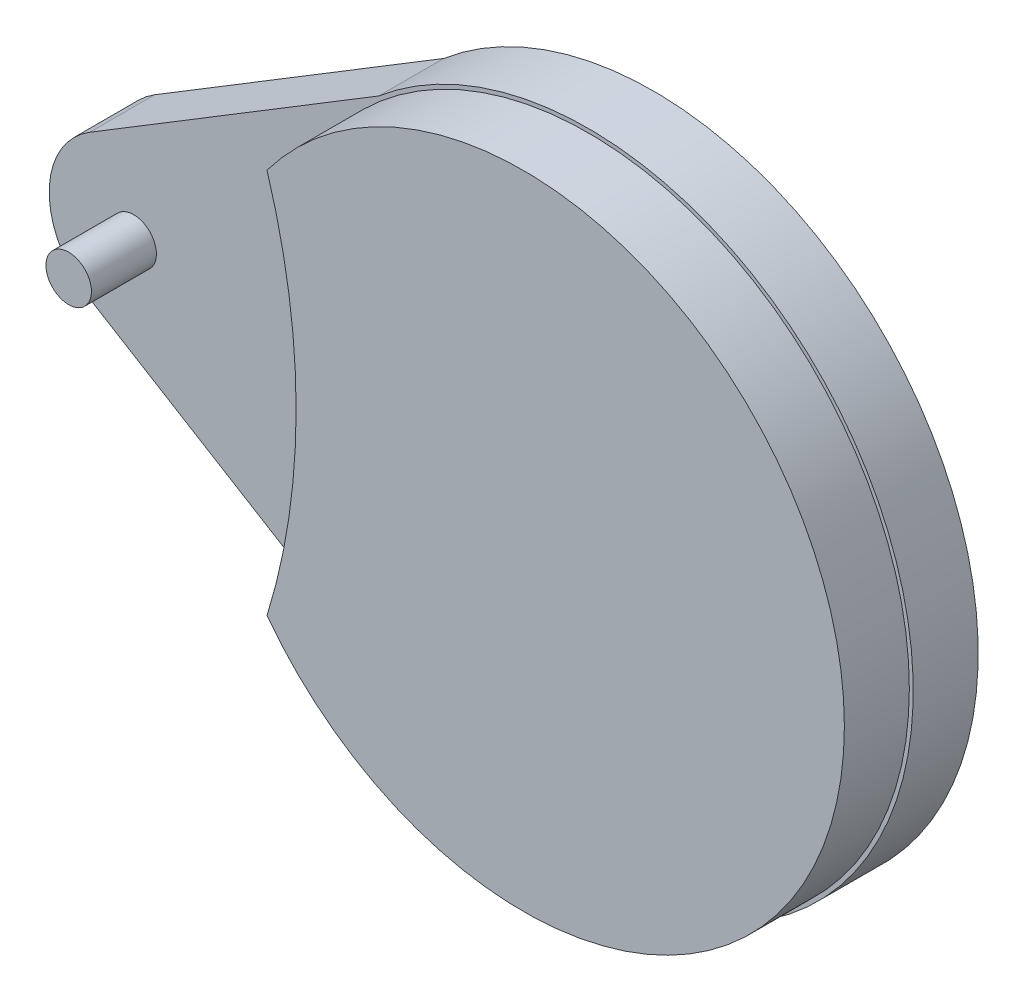
ISO-10303-21;
HEADER;
FILE_DESCRIPTION(('STEP AP214'),'2;1');
FILE_NAME('part.step','',(''),(''),'','','');
FILE_SCHEMA(('AUTOMOTIVE_DESIGN { 1 0 10303 214 1 1 1 1 }'));
ENDSEC;
DATA;
#1=APPLICATION_CONTEXT('core data for automotive mechanical design processes');
#2=APPLICATION_PROTOCOL_DEFINITION('international standard','automotive_design',2000,#1);
#3=PRODUCT_CONTEXT('',#1,'mechanical');
#4=PRODUCT('Part','Part','',(#3));
#5=PRODUCT_RELATED_PRODUCT_CATEGORY('part','',(#4));
#6=PRODUCT_DEFINITION_FORMATION('','',#4);
#7=PRODUCT_DEFINITION_CONTEXT('part definition',#1,'design');
#8=PRODUCT_DEFINITION('design','',#6,#7);
#9=PRODUCT_DEFINITION_SHAPE('','',#8);
#10=(LENGTH_UNIT() NAMED_UNIT(*) SI_UNIT(.MILLI.,.METRE.));
#11=(NAMED_UNIT(*) PLANE_ANGLE_UNIT() SI_UNIT($,.RADIAN.));
#12=(NAMED_UNIT(*) SI_UNIT($,.STERADIAN.) SOLID_ANGLE_UNIT());
#13=UNCERTAINTY_MEASURE_WITH_UNIT(LENGTH_MEASURE(1.E-05),#10,'distance_accuracy_value','');
#14=(GEOMETRIC_REPRESENTATION_CONTEXT(3) GLOBAL_UNCERTAINTY_ASSIGNED_CONTEXT((#13)) GLOBAL_UNIT_ASSIGNED_CONTEXT((#10,
#11,#12)) REPRESENTATION_CONTEXT('',''));
#15=CARTESIAN_POINT('',(0.,0.,0.));
#16=DIRECTION('',(0.,0.,1.));
#17=DIRECTION('',(1.,0.,0.));
#18=AXIS2_PLACEMENT_3D('',#15,#16,#17);
#19=CARTESIAN_POINT('',(5.48808372365144,-9.01487682632704,-5.));
#20=DIRECTION('',(0.52,-0.854166260162505,0.));
#21=DIRECTION('',(0.854166260162505,0.52,0.));
#22=AXIS2_PLACEMENT_3D('',#19,#20,#21);
#23=PLANE('',#22);
#24=DIRECTION('',(0.854166260162505,0.52,0.));
#25=VECTOR('',#24,1.);
#26=CARTESIAN_POINT('',(5.48808372365144,-9.01487682632704,0.));
#27=LINE('',#26,#25);
#28=CARTESIAN_POINT('',(29.4161676170541,5.55208069105628,0.));
#29=VERTEX_POINT('',#28);
#30=CARTESIAN_POINT('',(51.6539353632551,19.0900062300778,0.));
#31=VERTEX_POINT('',#30);
#32=EDGE_CURVE('E118',#29,#31,#27,.T.);
#33=ORIENTED_EDGE('',*,*,#32,.T.);
#34=DIRECTION('',(0.,0.,1.));
#35=VECTOR('',#34,1.);
#36=CARTESIAN_POINT('',(51.6539353632551,19.0900062300778,-5.));
#37=LINE('',#36,#35);
#38=CARTESIAN_POINT('',(51.6539353632551,19.0900062300778,-5.));
#39=VERTEX_POINT('',#38);
#40=EDGE_CURVE('E11',#39,#31,#37,.T.);
#41=ORIENTED_EDGE('',*,*,#40,.F.);
#42=DIRECTION('',(0.854166260162505,0.52,0.));
#43=VECTOR('',#42,1.);
#44=CARTESIAN_POINT('',(5.48808372365144,-9.01487682632704,-5.));
#45=LINE('',#44,#43);
#46=CARTESIAN_POINT('',(29.4161676170541,5.55208069105628,-5.));
#47=VERTEX_POINT('',#46);
#48=EDGE_CURVE('E73',#47,#39,#45,.T.);
#49=ORIENTED_EDGE('',*,*,#48,.F.);
#50=DIRECTION('',(0.,0.,1.));
#51=VECTOR('',#50,1.);
#52=CARTESIAN_POINT('',(29.4161676170541,5.55208069105628,-5.));
#53=LINE('',#52,#51);
#54=EDGE_CURVE('E50',#47,#29,#53,.T.);
#55=ORIENTED_EDGE('',*,*,#54,.T.);
#56=EDGE_LOOP('',(#33,#41,#49,#55));
#57=FACE_BOUND('',#56,.T.);
#58=ADVANCED_FACE('F47',(#57),#23,.F.);
#59=CARTESIAN_POINT('',(67.7961676170542,0.,-5.));
#60=DIRECTION('',(0.,0.,1.));
#61=DIRECTION('',(1.,0.,0.));
#62=AXIS2_PLACEMENT_3D('',#59,#60,#61);
#63=CYLINDRICAL_SURFACE('',#62,25.);
#64=CARTESIAN_POINT('',(67.7961676170542,0.,0.));
#65=DIRECTION('',(0.,0.,1.));
#66=DIRECTION('',(1.,0.,0.));
#67=AXIS2_PLACEMENT_3D('',#64,#65,#66);
#68=CIRCLE('',#67,25.);
#69=CARTESIAN_POINT('',(51.6539353632551,-19.0900062300778,0.));
#70=VERTEX_POINT('',#69);
#71=EDGE_CURVE('E142',#70,#31,#68,.T.);
#72=ORIENTED_EDGE('',*,*,#71,.F.);
#73=DIRECTION('',(0.,0.,1.));
#74=VECTOR('',#73,1.);
#75=CARTESIAN_POINT('',(51.6539353632551,-19.0900062300778,-5.));
#76=LINE('',#75,#74);
#77=CARTESIAN_POINT('',(51.6539353632551,-19.0900062300778,-5.));
#78=VERTEX_POINT('',#77);
#79=EDGE_CURVE('E56',#78,#70,#76,.T.);
#80=ORIENTED_EDGE('',*,*,#79,.F.);
#81=CARTESIAN_POINT('',(67.7961676170542,0.,-5.));
#82=DIRECTION('',(0.,0.,1.));
#83=DIRECTION('',(1.,0.,0.));
#84=AXIS2_PLACEMENT_3D('',#81,#82,#83);
#85=CIRCLE('',#84,25.);
#86=EDGE_CURVE('E149',#78,#39,#85,.T.);
#87=ORIENTED_EDGE('',*,*,#86,.T.);
#88=ORIENTED_EDGE('',*,*,#40,.T.);
#89=EDGE_LOOP('',(#72,#80,#87,#88));
#90=FACE_BOUND('',#89,.T.);
#91=ADVANCED_FACE('F183',(#90),#63,.T.);
#92=CARTESIAN_POINT('',(5.48808372365144,9.01487682632704,-5.));
#93=DIRECTION('',(-0.52,-0.854166260162505,0.));
#94=DIRECTION('',(0.854166260162505,-0.52,0.));
#95=AXIS2_PLACEMENT_3D('',#92,#93,#94);
#96=PLANE('',#95);
#97=DIRECTION('',(0.854166260162505,-0.52,0.));
#98=VECTOR('',#97,1.);
#99=CARTESIAN_POINT('',(5.48808372365144,9.01487682632704,0.));
#100=LINE('',#99,#98);
#101=CARTESIAN_POINT('',(29.4161676170541,-5.55208069105628,0.));
#102=VERTEX_POINT('',#101);
#103=EDGE_CURVE('E158',#102,#70,#100,.T.);
#104=ORIENTED_EDGE('',*,*,#103,.F.);
#105=DIRECTION('',(0.,0.,1.));
#106=VECTOR('',#105,1.);
#107=CARTESIAN_POINT('',(29.4161676170541,-5.55208069105628,-5.));
#108=LINE('',#107,#106);
#109=CARTESIAN_POINT('',(29.4161676170541,-5.55208069105628,-5.));
#110=VERTEX_POINT('',#109);
#111=EDGE_CURVE('E166',#110,#102,#108,.T.);
#112=ORIENTED_EDGE('',*,*,#111,.F.);
#113=DIRECTION('',(0.854166260162505,-0.52,0.));
#114=VECTOR('',#113,1.);
#115=CARTESIAN_POINT('',(5.48808372365144,9.01487682632704,-5.));
#116=LINE('',#115,#114);
#117=EDGE_CURVE('E145',#110,#78,#116,.T.);
#118=ORIENTED_EDGE('',*,*,#117,.T.);
#119=ORIENTED_EDGE('',*,*,#79,.T.);
#120=EDGE_LOOP('',(#104,#112,#118,#119));
#121=FACE_BOUND('',#120,.T.);
#122=ADVANCED_FACE('F177',(#121),#96,.T.);
#123=CARTESIAN_POINT('',(32.7961676170541,0.,-5.));
#124=DIRECTION('',(0.,0.,1.));
#125=DIRECTION('',(1.,0.,0.));
#126=AXIS2_PLACEMENT_3D('',#123,#124,#125);
#127=CYLINDRICAL_SURFACE('',#126,6.5);
#128=CARTESIAN_POINT('',(32.7961676170541,0.,0.));
#129=DIRECTION('',(0.,0.,1.));
#130=DIRECTION('',(1.,0.,0.));
#131=AXIS2_PLACEMENT_3D('',#128,#129,#130);
#132=CIRCLE('',#131,6.5);
#133=EDGE_CURVE('E154',#29,#102,#132,.T.);
#134=ORIENTED_EDGE('',*,*,#133,.F.);
#135=ORIENTED_EDGE('',*,*,#54,.F.);
#136=CARTESIAN_POINT('',(32.7961676170541,0.,-5.));
#137=DIRECTION('',(0.,0.,1.));
#138=DIRECTION('',(1.,0.,0.));
#139=AXIS2_PLACEMENT_3D('',#136,#137,#138);
#140=CIRCLE('',#139,6.5);
#141=EDGE_CURVE('E141',#47,#110,#140,.T.);
#142=ORIENTED_EDGE('',*,*,#141,.T.);
#143=ORIENTED_EDGE('',*,*,#111,.T.);
#144=EDGE_LOOP('',(#134,#135,#142,#143));
#145=FACE_BOUND('',#144,.T.);
#146=ADVANCED_FACE('F174',(#145),#127,.T.);
#147=CARTESIAN_POINT('',(0.,0.,-5.));
#148=DIRECTION('',(0.,0.,1.));
#149=DIRECTION('',(1.,0.,0.));
#150=AXIS2_PLACEMENT_3D('',#147,#148,#149);
#151=PLANE('',#150);
#152=ORIENTED_EDGE('',*,*,#48,.T.);
#153=ORIENTED_EDGE('',*,*,#86,.F.);
#154=ORIENTED_EDGE('',*,*,#117,.F.);
#155=ORIENTED_EDGE('',*,*,#141,.F.);
#156=EDGE_LOOP('',(#152,#153,#154,#155));
#157=FACE_BOUND('',#156,.T.);
#158=ADVANCED_FACE('F176',(#157),#151,.F.);
#159=CARTESIAN_POINT('',(0.,0.,0.));
#160=DIRECTION('',(0.,0.,1.));
#161=DIRECTION('',(1.,0.,0.));
#162=AXIS2_PLACEMENT_3D('',#159,#160,#161);
#163=PLANE('',#162);
#164=CARTESIAN_POINT('',(32.7961676170541,0.,0.));
#165=DIRECTION('',(0.,0.,1.));
#166=DIRECTION('',(1.,0.,0.));
#167=AXIS2_PLACEMENT_3D('',#164,#165,#166);
#168=CIRCLE('',#167,1.75);
#169=CARTESIAN_POINT('',(34.5461676170541,0.,0.));
#170=VERTEX_POINT('',#169);
#171=EDGE_CURVE('E215',#170,#170,#168,.T.);
#172=ORIENTED_EDGE('',*,*,#171,.F.);
#173=EDGE_LOOP('',(#172));
#174=FACE_BOUND('',#173,.T.);
#175=CARTESIAN_POINT('',(67.7961676170542,0.,0.));
#176=DIRECTION('',(0.,0.,1.));
#177=DIRECTION('',(1.,0.,0.));
#178=AXIS2_PLACEMENT_3D('',#175,#176,#177);
#179=CIRCLE('',#178,24.7);
#180=CARTESIAN_POINT('',(48.0581762406325,14.8492995263853,0.));
#181=VERTEX_POINT('',#180);
#182=CARTESIAN_POINT('',(48.0581762406325,-14.8492995263853,0.));
#183=VERTEX_POINT('',#182);
#184=EDGE_CURVE('E125',#181,#183,#179,.F.);
#185=ORIENTED_EDGE('',*,*,#184,.T.);
#186=CARTESIAN_POINT('',(0.,0.,0.));
#187=DIRECTION('',(0.,0.,1.));
#188=DIRECTION('',(1.,0.,0.));
#189=AXIS2_PLACEMENT_3D('',#186,#187,#188);
#190=CIRCLE('',#189,50.3);
#191=EDGE_CURVE('E64',#183,#181,#190,.T.);
#192=ORIENTED_EDGE('',*,*,#191,.T.);
#193=EDGE_LOOP('',(#185,#192));
#194=FACE_BOUND('',#193,.T.);
#195=ORIENTED_EDGE('',*,*,#32,.F.);
#196=ORIENTED_EDGE('',*,*,#133,.T.);
#197=ORIENTED_EDGE('',*,*,#103,.T.);
#198=ORIENTED_EDGE('',*,*,#71,.T.);
#199=EDGE_LOOP('',(#195,#196,#197,#198));
#200=FACE_BOUND('',#199,.T.);
#201=ADVANCED_FACE('F173',(#174,#194,#200),#163,.T.);
#202=CARTESIAN_POINT('',(0.,0.,5.));
#203=DIRECTION('',(0.,0.,-1.));
#204=DIRECTION('',(-1.,0.,0.));
#205=AXIS2_PLACEMENT_3D('',#202,#203,#204);
#206=CYLINDRICAL_SURFACE('',#205,50.3);
#207=ORIENTED_EDGE('',*,*,#191,.F.);
#208=DIRECTION('',(0.,0.,-1.));
#209=VECTOR('',#208,1.);
#210=CARTESIAN_POINT('',(48.0581762406325,-14.8492995263853,5.));
#211=LINE('',#210,#209);
#212=CARTESIAN_POINT('',(48.0581762406325,-14.8492995263853,5.));
#213=VERTEX_POINT('',#212);
#214=EDGE_CURVE('E108',#213,#183,#211,.T.);
#215=ORIENTED_EDGE('',*,*,#214,.F.);
#216=CARTESIAN_POINT('',(0.,0.,5.));
#217=DIRECTION('',(0.,0.,1.));
#218=DIRECTION('',(1.,0.,0.));
#219=AXIS2_PLACEMENT_3D('',#216,#217,#218);
#220=CIRCLE('',#219,50.3);
#221=CARTESIAN_POINT('',(48.0581762406325,14.8492995263853,5.));
#222=VERTEX_POINT('',#221);
#223=EDGE_CURVE('E111',#213,#222,#220,.T.);
#224=ORIENTED_EDGE('',*,*,#223,.T.);
#225=DIRECTION('',(0.,0.,-1.));
#226=VECTOR('',#225,1.);
#227=CARTESIAN_POINT('',(48.0581762406325,14.8492995263853,5.));
#228=LINE('',#227,#226);
#229=EDGE_CURVE('E119',#222,#181,#228,.T.);
#230=ORIENTED_EDGE('',*,*,#229,.T.);
#231=EDGE_LOOP('',(#207,#215,#224,#230));
#232=FACE_BOUND('',#231,.T.);
#233=ADVANCED_FACE('F110',(#232),#206,.F.);
#234=CARTESIAN_POINT('',(67.7961676170542,0.,5.));
#235=DIRECTION('',(0.,0.,-1.));
#236=DIRECTION('',(-1.,0.,0.));
#237=AXIS2_PLACEMENT_3D('',#234,#235,#236);
#238=CYLINDRICAL_SURFACE('',#237,24.7);
#239=ORIENTED_EDGE('',*,*,#184,.F.);
#240=ORIENTED_EDGE('',*,*,#229,.F.);
#241=CARTESIAN_POINT('',(67.7961676170542,0.,5.));
#242=DIRECTION('',(0.,0.,1.));
#243=DIRECTION('',(1.,0.,0.));
#244=AXIS2_PLACEMENT_3D('',#241,#242,#243);
#245=CIRCLE('',#244,24.7);
#246=EDGE_CURVE('E123',#222,#213,#245,.F.);
#247=ORIENTED_EDGE('',*,*,#246,.T.);
#248=ORIENTED_EDGE('',*,*,#214,.T.);
#249=EDGE_LOOP('',(#239,#240,#247,#248));
#250=FACE_BOUND('',#249,.T.);
#251=ADVANCED_FACE('F127',(#250),#238,.T.);
#252=CARTESIAN_POINT('',(0.,0.,5.));
#253=DIRECTION('',(0.,0.,1.));
#254=DIRECTION('',(1.,0.,0.));
#255=AXIS2_PLACEMENT_3D('',#252,#253,#254);
#256=PLANE('',#255);
#257=ORIENTED_EDGE('',*,*,#223,.F.);
#258=ORIENTED_EDGE('',*,*,#246,.F.);
#259=EDGE_LOOP('',(#257,#258));
#260=FACE_BOUND('',#259,.T.);
#261=ADVANCED_FACE('F122',(#260),#256,.T.);
#262=CARTESIAN_POINT('',(32.7961676170541,0.,5.));
#263=DIRECTION('',(0.,0.,-1.));
#264=DIRECTION('',(-1.,0.,0.));
#265=AXIS2_PLACEMENT_3D('',#262,#263,#264);
#266=CYLINDRICAL_SURFACE('',#265,1.75);
#267=CARTESIAN_POINT('',(32.7961676170541,0.,5.));
#268=DIRECTION('',(0.,0.,1.));
#269=DIRECTION('',(1.,0.,0.));
#270=AXIS2_PLACEMENT_3D('',#267,#268,#269);
#271=CIRCLE('',#270,1.75);
#272=CARTESIAN_POINT('',(34.5461676170541,0.,5.));
#273=VERTEX_POINT('',#272);
#274=EDGE_CURVE('E136',#273,#273,#271,.T.);
#275=ORIENTED_EDGE('',*,*,#274,.F.);
#276=EDGE_LOOP('',(#275));
#277=FACE_BOUND('',#276,.T.);
#278=ORIENTED_EDGE('',*,*,#171,.T.);
#279=EDGE_LOOP('',(#278));
#280=FACE_BOUND('',#279,.T.);
#281=ADVANCED_FACE('F203',(#277,#280),#266,.T.);
#282=CARTESIAN_POINT('',(0.,0.,5.));
#283=DIRECTION('',(0.,0.,1.));
#284=DIRECTION('',(1.,0.,0.));
#285=AXIS2_PLACEMENT_3D('',#282,#283,#284);
#286=PLANE('',#285);
#287=ORIENTED_EDGE('',*,*,#274,.T.);
#288=EDGE_LOOP('',(#287));
#289=FACE_BOUND('',#288,.T.);
#290=ADVANCED_FACE('F206',(#289),#286,.T.);
#291=CLOSED_SHELL('',(#58,#91,#122,#146,#158,#201,#233,#251,#261,#281,#290));
#292=MANIFOLD_SOLID_BREP('B2',#291);
#293=ADVANCED_BREP_SHAPE_REPRESENTATION('',(#18,#292),#14);
#294=SHAPE_DEFINITION_REPRESENTATION(#9,#293);
ENDSEC;
END-ISO-10303-21;
